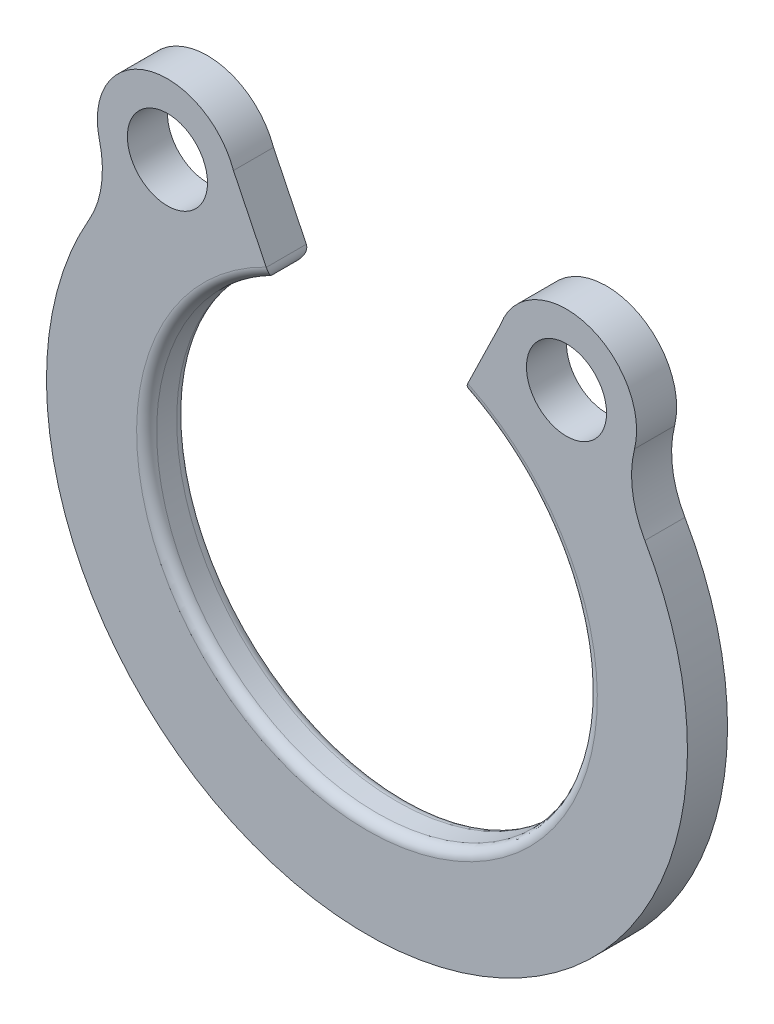
ISO-10303-21;
HEADER;
FILE_DESCRIPTION(('STEP AP214'),'2;1');
FILE_NAME('part.step','',(''),(''),'','','');
FILE_SCHEMA(('AUTOMOTIVE_DESIGN { 1 0 10303 214 1 1 1 1 }'));
ENDSEC;
DATA;
#1=APPLICATION_CONTEXT('core data for automotive mechanical design processes');
#2=APPLICATION_PROTOCOL_DEFINITION('international standard','automotive_design',2000,#1);
#3=PRODUCT_CONTEXT('',#1,'mechanical');
#4=PRODUCT('Part','Part','',(#3));
#5=PRODUCT_RELATED_PRODUCT_CATEGORY('part','',(#4));
#6=PRODUCT_DEFINITION_FORMATION('','',#4);
#7=PRODUCT_DEFINITION_CONTEXT('part definition',#1,'design');
#8=PRODUCT_DEFINITION('design','',#6,#7);
#9=PRODUCT_DEFINITION_SHAPE('','',#8);
#10=(LENGTH_UNIT() NAMED_UNIT(*) SI_UNIT(.MILLI.,.METRE.));
#11=(NAMED_UNIT(*) PLANE_ANGLE_UNIT() SI_UNIT($,.RADIAN.));
#12=(NAMED_UNIT(*) SI_UNIT($,.STERADIAN.) SOLID_ANGLE_UNIT());
#13=UNCERTAINTY_MEASURE_WITH_UNIT(LENGTH_MEASURE(1.E-05),#10,'distance_accuracy_value','');
#14=(GEOMETRIC_REPRESENTATION_CONTEXT(3) GLOBAL_UNCERTAINTY_ASSIGNED_CONTEXT((#13)) GLOBAL_UNIT_ASSIGNED_CONTEXT((#10,
#11,#12)) REPRESENTATION_CONTEXT('',''));
#15=CARTESIAN_POINT('',(0.,0.,0.));
#16=DIRECTION('',(0.,0.,1.));
#17=DIRECTION('',(1.,0.,0.));
#18=AXIS2_PLACEMENT_3D('',#15,#16,#17);
#19=CARTESIAN_POINT('',(0.,0.,-0.5));
#20=DIRECTION('',(0.,0.,1.));
#21=DIRECTION('',(1.,0.,0.));
#22=AXIS2_PLACEMENT_3D('',#19,#20,#21);
#23=CYLINDRICAL_SURFACE('',#22,8.);
#24=CARTESIAN_POINT('',(0.,0.,-0.5));
#25=DIRECTION('',(0.,0.,1.));
#26=DIRECTION('',(1.,0.,0.));
#27=AXIS2_PLACEMENT_3D('',#24,#25,#26);
#28=CIRCLE('',#27,8.);
#29=CARTESIAN_POINT('',(-6.93635011466133,3.98585587883428,-0.5));
#30=VERTEX_POINT('',#29);
#31=CARTESIAN_POINT('',(6.93635011466133,3.98585587883428,-0.5));
#32=VERTEX_POINT('',#31);
#33=EDGE_CURVE('E153',#30,#32,#28,.T.);
#34=ORIENTED_EDGE('',*,*,#33,.T.);
#35=DIRECTION('',(0.,0.,1.));
#36=VECTOR('',#35,1.);
#37=CARTESIAN_POINT('',(6.93635011466133,3.98585587883428,-0.5));
#38=LINE('',#37,#36);
#39=CARTESIAN_POINT('',(6.93635011466133,3.98585587883428,0.5));
#40=VERTEX_POINT('',#39);
#41=EDGE_CURVE('E191',#32,#40,#38,.T.);
#42=ORIENTED_EDGE('',*,*,#41,.T.);
#43=CARTESIAN_POINT('',(0.,0.,0.5));
#44=DIRECTION('',(0.,0.,1.));
#45=DIRECTION('',(1.,0.,0.));
#46=AXIS2_PLACEMENT_3D('',#43,#44,#45);
#47=CIRCLE('',#46,8.);
#48=CARTESIAN_POINT('',(-6.93635011466133,3.98585587883428,0.5));
#49=VERTEX_POINT('',#48);
#50=EDGE_CURVE('E181',#49,#40,#47,.T.);
#51=ORIENTED_EDGE('',*,*,#50,.F.);
#52=DIRECTION('',(0.,0.,1.));
#53=VECTOR('',#52,1.);
#54=CARTESIAN_POINT('',(-6.93635011466133,3.98585587883428,-0.5));
#55=LINE('',#54,#53);
#56=EDGE_CURVE('E152',#49,#30,#55,.F.);
#57=ORIENTED_EDGE('',*,*,#56,.T.);
#58=EDGE_LOOP('',(#34,#42,#51,#57));
#59=FACE_BOUND('',#58,.T.);
#60=ADVANCED_FACE('F35',(#59),#23,.T.);
#61=CARTESIAN_POINT('',(0.,0.,-0.5));
#62=DIRECTION('',(-0.899218410621135,0.4375,0.));
#63=DIRECTION('',(-0.4375,-0.899218410621135,0.));
#64=AXIS2_PLACEMENT_3D('',#61,#62,#63);
#65=PLANE('',#64);
#66=DIRECTION('',(-0.4375,-0.899218410621135,0.));
#67=VECTOR('',#66,1.);
#68=CARTESIAN_POINT('',(0.,0.,-0.5));
#69=LINE('',#68,#67);
#70=CARTESIAN_POINT('',(3.33251953125,6.84951523715318,-0.5));
#71=VERTEX_POINT('',#70);
#72=CARTESIAN_POINT('',(2.515625,5.17050586107153,-0.5));
#73=VERTEX_POINT('',#72);
#74=EDGE_CURVE('E145',#71,#73,#69,.T.);
#75=ORIENTED_EDGE('',*,*,#74,.T.);
#76=CARTESIAN_POINT('',(2.515625,5.17050586107153,-0.25));
#77=DIRECTION('',(-0.899218410621135,0.4375,0.));
#78=DIRECTION('',(-0.4375,-0.899218410621135,0.));
#79=AXIS2_PLACEMENT_3D('',#76,#77,#78);
#80=CIRCLE('',#79,0.25);
#81=CARTESIAN_POINT('',(2.51324615786039,5.16561649273347,-0.49994086338038));
#82=VERTEX_POINT('',#81);
#83=EDGE_CURVE('E210',#73,#82,#80,.T.);
#84=ORIENTED_EDGE('',*,*,#83,.T.);
#85=DIRECTION('',(0.,0.,-1.));
#86=VECTOR('',#85,1.);
#87=CARTESIAN_POINT('',(2.51324615786039,5.16561649273347,0.5));
#88=LINE('',#87,#86);
#89=CARTESIAN_POINT('',(2.51324615786039,5.16561649273347,0.49994086338038));
#90=VERTEX_POINT('',#89);
#91=EDGE_CURVE('E208',#82,#90,#88,.F.);
#92=ORIENTED_EDGE('',*,*,#91,.T.);
#93=CARTESIAN_POINT('',(2.515625,5.17050586107153,0.25));
#94=DIRECTION('',(-0.899218410621135,0.4375,0.));
#95=DIRECTION('',(-0.4375,-0.899218410621135,0.));
#96=AXIS2_PLACEMENT_3D('',#93,#94,#95);
#97=CIRCLE('',#96,0.25);
#98=CARTESIAN_POINT('',(2.515625,5.17050586107153,0.5));
#99=VERTEX_POINT('',#98);
#100=EDGE_CURVE('E206',#90,#99,#97,.T.);
#101=ORIENTED_EDGE('',*,*,#100,.T.);
#102=DIRECTION('',(-0.4375,-0.899218410621135,0.));
#103=VECTOR('',#102,1.);
#104=CARTESIAN_POINT('',(0.,0.,0.5));
#105=LINE('',#104,#103);
#106=CARTESIAN_POINT('',(3.33251953125,6.84951523715318,0.5));
#107=VERTEX_POINT('',#106);
#108=EDGE_CURVE('E158',#107,#99,#105,.T.);
#109=ORIENTED_EDGE('',*,*,#108,.F.);
#110=DIRECTION('',(0.,0.,-1.));
#111=VECTOR('',#110,1.);
#112=CARTESIAN_POINT('',(3.33251953125001,6.84951523715319,5.44974746830583));
#113=LINE('',#112,#111);
#114=EDGE_CURVE('E135',#107,#71,#113,.T.);
#115=ORIENTED_EDGE('',*,*,#114,.T.);
#116=EDGE_LOOP('',(#75,#84,#92,#101,#109,#115));
#117=FACE_BOUND('',#116,.T.);
#118=ADVANCED_FACE('F156',(#117),#65,.T.);
#119=CARTESIAN_POINT('',(0.,0.,-0.5));
#120=DIRECTION('',(0.899218410621135,0.4375,0.));
#121=DIRECTION('',(-0.4375,0.899218410621135,0.));
#122=AXIS2_PLACEMENT_3D('',#119,#120,#121);
#123=PLANE('',#122);
#124=DIRECTION('',(0.,0.,-1.));
#125=VECTOR('',#124,1.);
#126=CARTESIAN_POINT('',(-2.51324615786039,5.16561649273347,-0.5));
#127=LINE('',#126,#125);
#128=CARTESIAN_POINT('',(-2.51324615786039,5.16561649273347,0.49994086338038));
#129=VERTEX_POINT('',#128);
#130=CARTESIAN_POINT('',(-2.51324615786039,5.16561649273347,-0.49994086338038));
#131=VERTEX_POINT('',#130);
#132=EDGE_CURVE('E57',#129,#131,#127,.T.);
#133=ORIENTED_EDGE('',*,*,#132,.T.);
#134=CARTESIAN_POINT('',(-2.515625,5.17050586107153,-0.25));
#135=DIRECTION('',(0.899218410621135,0.4375,0.));
#136=DIRECTION('',(-0.4375,0.899218410621135,0.));
#137=AXIS2_PLACEMENT_3D('',#134,#135,#136);
#138=CIRCLE('',#137,0.25);
#139=CARTESIAN_POINT('',(-2.515625,5.17050586107153,-0.5));
#140=VERTEX_POINT('',#139);
#141=EDGE_CURVE('E49',#131,#140,#138,.T.);
#142=ORIENTED_EDGE('',*,*,#141,.T.);
#143=DIRECTION('',(-0.4375,0.899218410621135,0.));
#144=VECTOR('',#143,1.);
#145=CARTESIAN_POINT('',(0.,0.,-0.5));
#146=LINE('',#145,#144);
#147=CARTESIAN_POINT('',(-3.33251953125,6.84951523715318,-0.5));
#148=VERTEX_POINT('',#147);
#149=EDGE_CURVE('E185',#140,#148,#146,.T.);
#150=ORIENTED_EDGE('',*,*,#149,.T.);
#151=DIRECTION('',(0.,0.,-1.));
#152=VECTOR('',#151,1.);
#153=CARTESIAN_POINT('',(-3.33251953125,6.84951523715318,5.44974746830583));
#154=LINE('',#153,#152);
#155=CARTESIAN_POINT('',(-3.33251953125,6.84951523715318,0.5));
#156=VERTEX_POINT('',#155);
#157=EDGE_CURVE('E174',#148,#156,#154,.F.);
#158=ORIENTED_EDGE('',*,*,#157,.T.);
#159=DIRECTION('',(-0.4375,0.899218410621135,0.));
#160=VECTOR('',#159,1.);
#161=CARTESIAN_POINT('',(0.,0.,0.5));
#162=LINE('',#161,#160);
#163=CARTESIAN_POINT('',(-2.515625,5.17050586107153,0.5));
#164=VERTEX_POINT('',#163);
#165=EDGE_CURVE('E179',#164,#156,#162,.T.);
#166=ORIENTED_EDGE('',*,*,#165,.F.);
#167=CARTESIAN_POINT('',(-2.515625,5.17050586107153,0.25));
#168=DIRECTION('',(0.899218410621135,0.4375,0.));
#169=DIRECTION('',(-0.4375,0.899218410621135,0.));
#170=AXIS2_PLACEMENT_3D('',#167,#168,#169);
#171=CIRCLE('',#170,0.25);
#172=EDGE_CURVE('E62',#164,#129,#171,.T.);
#173=ORIENTED_EDGE('',*,*,#172,.T.);
#174=EDGE_LOOP('',(#133,#142,#150,#158,#166,#173));
#175=FACE_BOUND('',#174,.T.);
#176=ADVANCED_FACE('F265',(#175),#123,.T.);
#177=CARTESIAN_POINT('',(0.,0.,-0.5));
#178=DIRECTION('',(0.,0.,1.));
#179=DIRECTION('',(1.,0.,0.));
#180=AXIS2_PLACEMENT_3D('',#177,#178,#179);
#181=CYLINDRICAL_SURFACE('',#180,5.5);
#182=DIRECTION('',(0.,0.,1.));
#183=VECTOR('',#182,1.);
#184=CARTESIAN_POINT('',(2.61900507527586,4.83640490609288,-0.5));
#185=LINE('',#184,#183);
#186=CARTESIAN_POINT('',(2.61900507527586,4.83640490609288,0.25));
#187=VERTEX_POINT('',#186);
#188=CARTESIAN_POINT('',(2.61900507527586,4.83640490609288,-0.25));
#189=VERTEX_POINT('',#188);
#190=EDGE_CURVE('E216',#187,#189,#185,.F.);
#191=ORIENTED_EDGE('',*,*,#190,.T.);
#192=CARTESIAN_POINT('',(0.,0.,-0.25));
#193=DIRECTION('',(0.,0.,1.));
#194=DIRECTION('',(1.,0.,0.));
#195=AXIS2_PLACEMENT_3D('',#192,#193,#194);
#196=CIRCLE('',#195,5.5);
#197=CARTESIAN_POINT('',(-2.61900507527586,4.83640490609288,-0.25));
#198=VERTEX_POINT('',#197);
#199=EDGE_CURVE('E218',#189,#198,#196,.F.);
#200=ORIENTED_EDGE('',*,*,#199,.T.);
#201=DIRECTION('',(0.,0.,1.));
#202=VECTOR('',#201,1.);
#203=CARTESIAN_POINT('',(-2.61900507527586,4.83640490609288,-0.5));
#204=LINE('',#203,#202);
#205=CARTESIAN_POINT('',(-2.61900507527586,4.83640490609288,0.25));
#206=VERTEX_POINT('',#205);
#207=EDGE_CURVE('E212',#198,#206,#204,.T.);
#208=ORIENTED_EDGE('',*,*,#207,.T.);
#209=CARTESIAN_POINT('',(0.,0.,0.25));
#210=DIRECTION('',(0.,0.,1.));
#211=DIRECTION('',(1.,0.,0.));
#212=AXIS2_PLACEMENT_3D('',#209,#210,#211);
#213=CIRCLE('',#212,5.5);
#214=EDGE_CURVE('E214',#206,#187,#213,.T.);
#215=ORIENTED_EDGE('',*,*,#214,.T.);
#216=EDGE_LOOP('',(#191,#200,#208,#215));
#217=FACE_BOUND('',#216,.T.);
#218=ADVANCED_FACE('F271',(#217),#181,.F.);
#219=CARTESIAN_POINT('',(0.,0.,-0.5));
#220=DIRECTION('',(0.,0.,1.));
#221=DIRECTION('',(1.,0.,0.));
#222=AXIS2_PLACEMENT_3D('',#219,#220,#221);
#223=PLANE('',#222);
#224=ORIENTED_EDGE('',*,*,#149,.F.);
#225=CARTESIAN_POINT('',(0.,0.,-0.5));
#226=DIRECTION('',(0.,0.,1.));
#227=DIRECTION('',(1.,0.,0.));
#228=AXIS2_PLACEMENT_3D('',#225,#226,#227);
#229=CIRCLE('',#228,5.75);
#230=EDGE_CURVE('E150',#140,#73,#229,.T.);
#231=ORIENTED_EDGE('',*,*,#230,.T.);
#232=ORIENTED_EDGE('',*,*,#74,.F.);
#233=CARTESIAN_POINT('',(4.9804510690432,6.26059958381516,-0.5));
#234=DIRECTION('',(0.,0.,1.));
#235=DIRECTION('',(1.,0.,0.));
#236=AXIS2_PLACEMENT_3D('',#233,#234,#235);
#237=CIRCLE('',#236,1.75);
#238=CARTESIAN_POINT('',(6.67836631581664,5.83682627793774,-0.5));
#239=VERTEX_POINT('',#238);
#240=EDGE_CURVE('E130',#71,#239,#237,.F.);
#241=ORIENTED_EDGE('',*,*,#240,.T.);
#242=CARTESIAN_POINT('',(9.10395952549299,5.23143584096999,-0.5));
#243=DIRECTION('',(0.,0.,1.));
#244=DIRECTION('',(1.,0.,0.));
#245=AXIS2_PLACEMENT_3D('',#242,#243,#244);
#246=CIRCLE('',#245,2.5);
#247=EDGE_CURVE('E199',#239,#32,#246,.T.);
#248=ORIENTED_EDGE('',*,*,#247,.T.);
#249=ORIENTED_EDGE('',*,*,#33,.F.);
#250=CARTESIAN_POINT('',(-9.10395952549299,5.23143584097,-0.5));
#251=DIRECTION('',(0.,0.,1.));
#252=DIRECTION('',(1.,0.,0.));
#253=AXIS2_PLACEMENT_3D('',#250,#251,#252);
#254=CIRCLE('',#253,2.5);
#255=CARTESIAN_POINT('',(-6.67836631581664,5.83682627793774,-0.5));
#256=VERTEX_POINT('',#255);
#257=EDGE_CURVE('E201',#30,#256,#254,.T.);
#258=ORIENTED_EDGE('',*,*,#257,.T.);
#259=CARTESIAN_POINT('',(-4.9804510690432,6.26059958381516,-0.5));
#260=DIRECTION('',(0.,0.,1.));
#261=DIRECTION('',(1.,0.,0.));
#262=AXIS2_PLACEMENT_3D('',#259,#260,#261);
#263=CIRCLE('',#262,1.75);
#264=EDGE_CURVE('E163',#256,#148,#263,.F.);
#265=ORIENTED_EDGE('',*,*,#264,.T.);
#266=EDGE_LOOP('',(#224,#231,#232,#241,#248,#249,#258,#265));
#267=FACE_BOUND('',#266,.T.);
#268=CARTESIAN_POINT('',(4.9804510690432,6.26059958381516,-0.5));
#269=DIRECTION('',(0.,0.,1.));
#270=DIRECTION('',(1.,0.,0.));
#271=AXIS2_PLACEMENT_3D('',#268,#269,#270);
#272=CIRCLE('',#271,1.);
#273=CARTESIAN_POINT('',(5.9804510690432,6.26059958381516,-0.5));
#274=VERTEX_POINT('',#273);
#275=EDGE_CURVE('E141',#274,#274,#272,.F.);
#276=ORIENTED_EDGE('',*,*,#275,.F.);
#277=EDGE_LOOP('',(#276));
#278=FACE_BOUND('',#277,.T.);
#279=CARTESIAN_POINT('',(-4.9804510690432,6.26059958381516,-0.5));
#280=DIRECTION('',(0.,0.,1.));
#281=DIRECTION('',(1.,0.,0.));
#282=AXIS2_PLACEMENT_3D('',#279,#280,#281);
#283=CIRCLE('',#282,1.);
#284=CARTESIAN_POINT('',(-3.9804510690432,6.26059958381516,-0.5));
#285=VERTEX_POINT('',#284);
#286=EDGE_CURVE('E159',#285,#285,#283,.F.);
#287=ORIENTED_EDGE('',*,*,#286,.F.);
#288=EDGE_LOOP('',(#287));
#289=FACE_BOUND('',#288,.T.);
#290=ADVANCED_FACE('F147',(#267,#278,#289),#223,.F.);
#291=CARTESIAN_POINT('',(0.,0.,0.5));
#292=DIRECTION('',(0.,0.,1.));
#293=DIRECTION('',(1.,0.,0.));
#294=AXIS2_PLACEMENT_3D('',#291,#292,#293);
#295=PLANE('',#294);
#296=CARTESIAN_POINT('',(-4.9804510690432,6.26059958381516,0.5));
#297=DIRECTION('',(0.,0.,1.));
#298=DIRECTION('',(1.,0.,0.));
#299=AXIS2_PLACEMENT_3D('',#296,#297,#298);
#300=CIRCLE('',#299,1.);
#301=CARTESIAN_POINT('',(-3.9804510690432,6.26059958381516,0.5));
#302=VERTEX_POINT('',#301);
#303=EDGE_CURVE('E169',#302,#302,#300,.T.);
#304=ORIENTED_EDGE('',*,*,#303,.F.);
#305=EDGE_LOOP('',(#304));
#306=FACE_BOUND('',#305,.T.);
#307=CARTESIAN_POINT('',(4.9804510690432,6.26059958381516,0.5));
#308=DIRECTION('',(0.,0.,1.));
#309=DIRECTION('',(1.,0.,0.));
#310=AXIS2_PLACEMENT_3D('',#307,#308,#309);
#311=CIRCLE('',#310,1.);
#312=CARTESIAN_POINT('',(5.9804510690432,6.26059958381516,0.5));
#313=VERTEX_POINT('',#312);
#314=EDGE_CURVE('E140',#313,#313,#311,.T.);
#315=ORIENTED_EDGE('',*,*,#314,.F.);
#316=EDGE_LOOP('',(#315));
#317=FACE_BOUND('',#316,.T.);
#318=ORIENTED_EDGE('',*,*,#108,.T.);
#319=CARTESIAN_POINT('',(0.,0.,0.5));
#320=DIRECTION('',(0.,0.,1.));
#321=DIRECTION('',(1.,0.,0.));
#322=AXIS2_PLACEMENT_3D('',#319,#320,#321);
#323=CIRCLE('',#322,5.75);
#324=EDGE_CURVE('E11',#99,#164,#323,.F.);
#325=ORIENTED_EDGE('',*,*,#324,.T.);
#326=ORIENTED_EDGE('',*,*,#165,.T.);
#327=CARTESIAN_POINT('',(-4.9804510690432,6.26059958381516,0.5));
#328=DIRECTION('',(0.,0.,1.));
#329=DIRECTION('',(1.,0.,0.));
#330=AXIS2_PLACEMENT_3D('',#327,#328,#329);
#331=CIRCLE('',#330,1.75);
#332=CARTESIAN_POINT('',(-6.67836631581664,5.83682627793774,0.5));
#333=VERTEX_POINT('',#332);
#334=EDGE_CURVE('E171',#156,#333,#331,.T.);
#335=ORIENTED_EDGE('',*,*,#334,.T.);
#336=CARTESIAN_POINT('',(-9.10395952549299,5.23143584097,0.5));
#337=DIRECTION('',(0.,0.,1.));
#338=DIRECTION('',(1.,0.,0.));
#339=AXIS2_PLACEMENT_3D('',#336,#337,#338);
#340=CIRCLE('',#339,2.5);
#341=EDGE_CURVE('E203',#333,#49,#340,.F.);
#342=ORIENTED_EDGE('',*,*,#341,.T.);
#343=ORIENTED_EDGE('',*,*,#50,.T.);
#344=CARTESIAN_POINT('',(9.10395952549299,5.23143584096999,0.5));
#345=DIRECTION('',(0.,0.,1.));
#346=DIRECTION('',(1.,0.,0.));
#347=AXIS2_PLACEMENT_3D('',#344,#345,#346);
#348=CIRCLE('',#347,2.5);
#349=CARTESIAN_POINT('',(6.67836631581664,5.83682627793774,0.5));
#350=VERTEX_POINT('',#349);
#351=EDGE_CURVE('E197',#40,#350,#348,.F.);
#352=ORIENTED_EDGE('',*,*,#351,.T.);
#353=CARTESIAN_POINT('',(4.9804510690432,6.26059958381516,0.5));
#354=DIRECTION('',(0.,0.,1.));
#355=DIRECTION('',(1.,0.,0.));
#356=AXIS2_PLACEMENT_3D('',#353,#354,#355);
#357=CIRCLE('',#356,1.75);
#358=EDGE_CURVE('E160',#350,#107,#357,.T.);
#359=ORIENTED_EDGE('',*,*,#358,.T.);
#360=EDGE_LOOP('',(#318,#325,#326,#335,#342,#343,#352,#359));
#361=FACE_BOUND('',#360,.T.);
#362=ADVANCED_FACE('F288',(#306,#317,#361),#295,.T.);
#363=CARTESIAN_POINT('',(-4.9804510690432,6.26059958381516,5.44974746830583));
#364=DIRECTION('',(0.,0.,-1.));
#365=DIRECTION('',(-1.,0.,0.));
#366=AXIS2_PLACEMENT_3D('',#363,#364,#365);
#367=CYLINDRICAL_SURFACE('',#366,1.75);
#368=ORIENTED_EDGE('',*,*,#264,.F.);
#369=DIRECTION('',(0.,0.,-1.));
#370=VECTOR('',#369,1.);
#371=CARTESIAN_POINT('',(-6.67836631581664,5.83682627793774,5.44974746830583));
#372=LINE('',#371,#370);
#373=EDGE_CURVE('E195',#256,#333,#372,.F.);
#374=ORIENTED_EDGE('',*,*,#373,.T.);
#375=ORIENTED_EDGE('',*,*,#334,.F.);
#376=ORIENTED_EDGE('',*,*,#157,.F.);
#377=EDGE_LOOP('',(#368,#374,#375,#376));
#378=FACE_BOUND('',#377,.T.);
#379=ADVANCED_FACE('F304',(#378),#367,.T.);
#380=CARTESIAN_POINT('',(-4.9804510690432,6.26059958381516,5.44974746830583));
#381=DIRECTION('',(0.,0.,-1.));
#382=DIRECTION('',(-1.,0.,0.));
#383=AXIS2_PLACEMENT_3D('',#380,#381,#382);
#384=CYLINDRICAL_SURFACE('',#383,1.);
#385=ORIENTED_EDGE('',*,*,#286,.T.);
#386=EDGE_LOOP('',(#385));
#387=FACE_BOUND('',#386,.T.);
#388=ORIENTED_EDGE('',*,*,#303,.T.);
#389=EDGE_LOOP('',(#388));
#390=FACE_BOUND('',#389,.T.);
#391=ADVANCED_FACE('F306',(#387,#390),#384,.F.);
#392=CARTESIAN_POINT('',(4.9804510690432,6.26059958381516,5.44974746830583));
#393=DIRECTION('',(0.,0.,-1.));
#394=DIRECTION('',(-1.,0.,0.));
#395=AXIS2_PLACEMENT_3D('',#392,#393,#394);
#396=CYLINDRICAL_SURFACE('',#395,1.75);
#397=ORIENTED_EDGE('',*,*,#358,.F.);
#398=DIRECTION('',(0.,0.,-1.));
#399=VECTOR('',#398,1.);
#400=CARTESIAN_POINT('',(6.67836631581664,5.83682627793774,5.44974746830583));
#401=LINE('',#400,#399);
#402=EDGE_CURVE('E137',#350,#239,#401,.T.);
#403=ORIENTED_EDGE('',*,*,#402,.T.);
#404=ORIENTED_EDGE('',*,*,#240,.F.);
#405=ORIENTED_EDGE('',*,*,#114,.F.);
#406=EDGE_LOOP('',(#397,#403,#404,#405));
#407=FACE_BOUND('',#406,.T.);
#408=ADVANCED_FACE('F133',(#407),#396,.T.);
#409=CARTESIAN_POINT('',(4.9804510690432,6.26059958381516,5.44974746830583));
#410=DIRECTION('',(0.,0.,-1.));
#411=DIRECTION('',(-1.,0.,0.));
#412=AXIS2_PLACEMENT_3D('',#409,#410,#411);
#413=CYLINDRICAL_SURFACE('',#412,1.);
#414=ORIENTED_EDGE('',*,*,#275,.T.);
#415=EDGE_LOOP('',(#414));
#416=FACE_BOUND('',#415,.T.);
#417=ORIENTED_EDGE('',*,*,#314,.T.);
#418=EDGE_LOOP('',(#417));
#419=FACE_BOUND('',#418,.T.);
#420=ADVANCED_FACE('F277',(#416,#419),#413,.F.);
#421=CARTESIAN_POINT('',(9.10395952549299,5.23143584096999,5.44974746830583));
#422=DIRECTION('',(0.,0.,-1.));
#423=DIRECTION('',(-1.,0.,0.));
#424=AXIS2_PLACEMENT_3D('',#421,#422,#423);
#425=CYLINDRICAL_SURFACE('',#424,2.5);
#426=ORIENTED_EDGE('',*,*,#247,.F.);
#427=ORIENTED_EDGE('',*,*,#402,.F.);
#428=ORIENTED_EDGE('',*,*,#351,.F.);
#429=ORIENTED_EDGE('',*,*,#41,.F.);
#430=EDGE_LOOP('',(#426,#427,#428,#429));
#431=FACE_BOUND('',#430,.T.);
#432=ADVANCED_FACE('F275',(#431),#425,.F.);
#433=CARTESIAN_POINT('',(-9.10395952549299,5.23143584097,5.44974746830583));
#434=DIRECTION('',(0.,0.,1.));
#435=DIRECTION('',(1.,0.,0.));
#436=AXIS2_PLACEMENT_3D('',#433,#434,#435);
#437=CYLINDRICAL_SURFACE('',#436,2.5);
#438=ORIENTED_EDGE('',*,*,#341,.F.);
#439=ORIENTED_EDGE('',*,*,#373,.F.);
#440=ORIENTED_EDGE('',*,*,#257,.F.);
#441=ORIENTED_EDGE('',*,*,#56,.F.);
#442=EDGE_LOOP('',(#438,#439,#440,#441));
#443=FACE_BOUND('',#442,.T.);
#444=ADVANCED_FACE('F256',(#443),#437,.F.);
#445=CARTESIAN_POINT('',(0.,0.,0.25));
#446=DIRECTION('',(0.,0.,1.));
#447=DIRECTION('',(1.,0.,0.));
#448=AXIS2_PLACEMENT_3D('',#445,#446,#447);
#449=TOROIDAL_SURFACE('',#448,5.75,0.25);
#450=CARTESIAN_POINT('',(2.51324615786039,5.16561649273347,0.49994086338038));
#451=CARTESIAN_POINT('',(2.50828021385128,5.15545252221124,0.499714083352905));
#452=CARTESIAN_POINT('',(2.50405837557174,5.14498055006981,0.49868289522799));
#453=CARTESIAN_POINT('',(2.49712612029501,5.12387978877661,0.495190540188425));
#454=CARTESIAN_POINT('',(2.49440246339241,5.11325325417818,0.492742305501947));
#455=CARTESIAN_POINT('',(2.49040694884898,5.09213860660682,0.486593917703645));
#456=CARTESIAN_POINT('',(2.48913076006901,5.08165017399461,0.482897542605564));
#457=CARTESIAN_POINT('',(2.48788183046502,5.06100300052579,0.474467558744442));
#458=CARTESIAN_POINT('',(2.48791215500255,5.05084509098129,0.469731536625399));
#459=CARTESIAN_POINT('',(2.48938938000728,5.0267521287806,0.457208121685012));
#460=CARTESIAN_POINT('',(2.49144240437091,5.01308042152554,0.448986259260633));
#461=CARTESIAN_POINT('',(2.49746117753397,4.98698294490106,0.431355499346529));
#462=CARTESIAN_POINT('',(2.50143092802741,4.97455984820474,0.421944148957237));
#463=CARTESIAN_POINT('',(2.51283862221255,4.94625203345462,0.398320241462926));
#464=CARTESIAN_POINT('',(2.52103017132891,4.93100636479397,0.383708307426565));
#465=CARTESIAN_POINT('',(2.53973089274298,4.90310222286458,0.353560152462565));
#466=CARTESIAN_POINT('',(2.55024174169464,4.89044563409872,0.338023268839881));
#467=CARTESIAN_POINT('',(2.57001183603936,4.87076613862821,0.310744929296885));
#468=CARTESIAN_POINT('',(2.5788406002066,4.86314539534665,0.299113604746922));
#469=CARTESIAN_POINT('',(2.59734492600371,4.84927459931996,0.275740337263321));
#470=CARTESIAN_POINT('',(2.60701895421714,4.84302213373091,0.263998627761837));
#471=CARTESIAN_POINT('',(2.61771044330156,4.83710968463429,0.251507161753844));
#472=CARTESIAN_POINT('',(2.61835699929709,4.8367558567492,0.250753563752166));
#473=CARTESIAN_POINT('',(2.61900507527586,4.83640490609288,0.25));
#474=B_SPLINE_CURVE_WITH_KNOTS('',3,(#450,#451,#452,#453,#454,#455,#456,#457,#458,#459,#460,
#461,#462,#463,#464,#465,#466,#467,#468,#469,#470,#471,#472,#473),.UNSPECIFIED.,.F.,.F.,(4,2,2,
2,2,2,2,2,2,2,2,4),(0.,0.0338400456219434,0.067376023933256,0.100811388369374,0.134325203632232,
0.182312705753331,0.23040083108484,0.297988720018013,0.365625630186421,0.414967388451733,
0.464221422671975,0.467383715449194),.UNSPECIFIED.);
#475=EDGE_CURVE('E298',#187,#90,#474,.F.);
#476=ORIENTED_EDGE('',*,*,#475,.F.);
#477=ORIENTED_EDGE('',*,*,#214,.F.);
#478=CARTESIAN_POINT('',(-2.51324615786039,5.16561649273347,0.49994086338038));
#479=CARTESIAN_POINT('',(-2.50828021385128,5.15545252221124,0.499714083352905));
#480=CARTESIAN_POINT('',(-2.50405837557174,5.14498055006981,0.49868289522799));
#481=CARTESIAN_POINT('',(-2.49712612029501,5.12387978877661,0.495190540188425));
#482=CARTESIAN_POINT('',(-2.49440246339241,5.11325325417818,0.492742305501947));
#483=CARTESIAN_POINT('',(-2.49040694884898,5.09213860660682,0.486593917703645));
#484=CARTESIAN_POINT('',(-2.48913076006901,5.08165017399461,0.482897542605564));
#485=CARTESIAN_POINT('',(-2.48788183046502,5.06100300052579,0.474467558744442));
#486=CARTESIAN_POINT('',(-2.48791215500255,5.05084509098129,0.469731536625399));
#487=CARTESIAN_POINT('',(-2.48938938000728,5.0267521287806,0.457208121685012));
#488=CARTESIAN_POINT('',(-2.49144240437091,5.01308042152554,0.448986259260633));
#489=CARTESIAN_POINT('',(-2.49746117753397,4.98698294490106,0.431355499346529));
#490=CARTESIAN_POINT('',(-2.50143092802741,4.97455984820474,0.421944148957237));
#491=CARTESIAN_POINT('',(-2.51283862221255,4.94625203345462,0.398320241462926));
#492=CARTESIAN_POINT('',(-2.52103017132891,4.93100636479397,0.383708307426565));
#493=CARTESIAN_POINT('',(-2.53973089274298,4.90310222286458,0.353560152462565));
#494=CARTESIAN_POINT('',(-2.55024174169464,4.89044563409872,0.338023268839881));
#495=CARTESIAN_POINT('',(-2.57001183603936,4.87076613862821,0.310744929296885));
#496=CARTESIAN_POINT('',(-2.5788406002066,4.86314539534665,0.299113604746922));
#497=CARTESIAN_POINT('',(-2.59734492600371,4.84927459931996,0.275740337263321));
#498=CARTESIAN_POINT('',(-2.60701895421714,4.84302213373091,0.263998627761837));
#499=CARTESIAN_POINT('',(-2.61771044330156,4.83710968463429,0.251507161753844));
#500=CARTESIAN_POINT('',(-2.61835699929709,4.8367558567492,0.250753563752166));
#501=CARTESIAN_POINT('',(-2.61900507527586,4.83640490609288,0.25));
#502=B_SPLINE_CURVE_WITH_KNOTS('',3,(#478,#479,#480,#481,#482,#483,#484,#485,#486,#487,#488,
#489,#490,#491,#492,#493,#494,#495,#496,#497,#498,#499,#500,#501),.UNSPECIFIED.,.F.,.F.,(4,2,2,
2,2,2,2,2,2,2,2,4),(0.,0.0338400456219434,0.067376023933256,0.100811388369374,0.134325203632232,
0.182312705753331,0.23040083108484,0.297988720018013,0.365625630186421,0.414967388451733,
0.464221422671975,0.467383715449194),.UNSPECIFIED.);
#503=EDGE_CURVE('E40',#129,#206,#502,.T.);
#504=ORIENTED_EDGE('',*,*,#503,.F.);
#505=ORIENTED_EDGE('',*,*,#172,.F.);
#506=ORIENTED_EDGE('',*,*,#324,.F.);
#507=ORIENTED_EDGE('',*,*,#100,.F.);
#508=EDGE_LOOP('',(#476,#477,#504,#505,#506,#507));
#509=FACE_BOUND('',#508,.T.);
#510=ADVANCED_FACE('F37',(#509),#449,.T.);
#511=CARTESIAN_POINT('',(-2.73805076051567,5.05624149273347,-0.5));
#512=DIRECTION('',(0.,0.,1.));
#513=DIRECTION('',(1.,0.,0.));
#514=AXIS2_PLACEMENT_3D('',#511,#512,#513);
#515=CYLINDRICAL_SURFACE('',#514,0.25);
#516=ORIENTED_EDGE('',*,*,#503,.T.);
#517=ORIENTED_EDGE('',*,*,#207,.F.);
#518=CARTESIAN_POINT('',(-2.51324615786039,5.16561649273347,-0.49994086338038));
#519=CARTESIAN_POINT('',(-2.50828021385128,5.15545252221124,-0.499714083352905));
#520=CARTESIAN_POINT('',(-2.50405837557174,5.14498055006981,-0.49868289522799));
#521=CARTESIAN_POINT('',(-2.49712612029501,5.12387978877661,-0.495190540188425));
#522=CARTESIAN_POINT('',(-2.49440246339241,5.11325325417818,-0.492742305501947));
#523=CARTESIAN_POINT('',(-2.49040694884898,5.09213860660682,-0.486593917703645));
#524=CARTESIAN_POINT('',(-2.48913076006901,5.08165017399461,-0.482897542605564));
#525=CARTESIAN_POINT('',(-2.48788183046502,5.06100300052579,-0.474467558744442));
#526=CARTESIAN_POINT('',(-2.48791215500255,5.05084509098129,-0.469731536625399));
#527=CARTESIAN_POINT('',(-2.48938938000728,5.0267521287806,-0.457208121685012));
#528=CARTESIAN_POINT('',(-2.49144240437091,5.01308042152554,-0.448986259260633));
#529=CARTESIAN_POINT('',(-2.49746117753397,4.98698294490106,-0.431355499346529));
#530=CARTESIAN_POINT('',(-2.50143092802741,4.97455984820474,-0.421944148957237));
#531=CARTESIAN_POINT('',(-2.51283862221255,4.94625203345462,-0.398320241462926));
#532=CARTESIAN_POINT('',(-2.52103017132891,4.93100636479397,-0.383708307426565));
#533=CARTESIAN_POINT('',(-2.53973089274298,4.90310222286458,-0.353560152462565));
#534=CARTESIAN_POINT('',(-2.55024174169464,4.89044563409872,-0.338023268839881));
#535=CARTESIAN_POINT('',(-2.57001183603936,4.87076613862821,-0.310744929296885));
#536=CARTESIAN_POINT('',(-2.5788406002066,4.86314539534665,-0.299113604746922));
#537=CARTESIAN_POINT('',(-2.59734492600371,4.84927459931996,-0.275740337263321));
#538=CARTESIAN_POINT('',(-2.60701895421714,4.84302213373091,-0.263998627761837));
#539=CARTESIAN_POINT('',(-2.61771044330156,4.83710968463429,-0.251507161753844));
#540=CARTESIAN_POINT('',(-2.61835699929709,4.8367558567492,-0.250753563752166));
#541=CARTESIAN_POINT('',(-2.61900507527586,4.83640490609288,-0.25));
#542=B_SPLINE_CURVE_WITH_KNOTS('',3,(#518,#519,#520,#521,#522,#523,#524,#525,#526,#527,#528,
#529,#530,#531,#532,#533,#534,#535,#536,#537,#538,#539,#540,#541),.UNSPECIFIED.,.F.,.F.,(4,2,2,
2,2,2,2,2,2,2,2,4),(0.,0.0338400456219434,0.067376023933256,0.100811388369374,0.134325203632232,
0.182312705753331,0.23040083108484,0.297988720018013,0.365625630186421,0.414967388451733,
0.464221422671975,0.467383715449194),.UNSPECIFIED.);
#543=EDGE_CURVE('E233',#131,#198,#542,.T.);
#544=ORIENTED_EDGE('',*,*,#543,.F.);
#545=ORIENTED_EDGE('',*,*,#132,.F.);
#546=EDGE_LOOP('',(#516,#517,#544,#545));
#547=FACE_BOUND('',#546,.T.);
#548=ADVANCED_FACE('F245',(#547),#515,.T.);
#549=CARTESIAN_POINT('',(2.73805076051567,5.05624149273347,-0.5));
#550=DIRECTION('',(0.,0.,1.));
#551=DIRECTION('',(1.,0.,0.));
#552=AXIS2_PLACEMENT_3D('',#549,#550,#551);
#553=CYLINDRICAL_SURFACE('',#552,0.25);
#554=ORIENTED_EDGE('',*,*,#475,.T.);
#555=ORIENTED_EDGE('',*,*,#91,.F.);
#556=CARTESIAN_POINT('',(2.51324615786039,5.16561649273347,-0.49994086338038));
#557=CARTESIAN_POINT('',(2.50828021385128,5.15545252221124,-0.499714083352905));
#558=CARTESIAN_POINT('',(2.50405837557174,5.14498055006981,-0.49868289522799));
#559=CARTESIAN_POINT('',(2.49712612029501,5.12387978877661,-0.495190540188425));
#560=CARTESIAN_POINT('',(2.49440246339241,5.11325325417818,-0.492742305501947));
#561=CARTESIAN_POINT('',(2.49040694884898,5.09213860660682,-0.486593917703645));
#562=CARTESIAN_POINT('',(2.48913076006901,5.08165017399461,-0.482897542605564));
#563=CARTESIAN_POINT('',(2.48788183046502,5.06100300052579,-0.474467558744442));
#564=CARTESIAN_POINT('',(2.48791215500255,5.05084509098129,-0.469731536625399));
#565=CARTESIAN_POINT('',(2.48938938000728,5.0267521287806,-0.457208121685012));
#566=CARTESIAN_POINT('',(2.49144240437091,5.01308042152554,-0.448986259260633));
#567=CARTESIAN_POINT('',(2.49746117753397,4.98698294490106,-0.431355499346529));
#568=CARTESIAN_POINT('',(2.50143092802741,4.97455984820474,-0.421944148957237));
#569=CARTESIAN_POINT('',(2.51283862221255,4.94625203345462,-0.398320241462926));
#570=CARTESIAN_POINT('',(2.52103017132891,4.93100636479397,-0.383708307426565));
#571=CARTESIAN_POINT('',(2.53973089274298,4.90310222286458,-0.353560152462565));
#572=CARTESIAN_POINT('',(2.55024174169464,4.89044563409872,-0.338023268839881));
#573=CARTESIAN_POINT('',(2.57001183603936,4.87076613862821,-0.310744929296885));
#574=CARTESIAN_POINT('',(2.5788406002066,4.86314539534665,-0.299113604746922));
#575=CARTESIAN_POINT('',(2.59734492600371,4.84927459931996,-0.275740337263321));
#576=CARTESIAN_POINT('',(2.60701895421714,4.84302213373091,-0.263998627761837));
#577=CARTESIAN_POINT('',(2.61771044330156,4.83710968463429,-0.251507161753844));
#578=CARTESIAN_POINT('',(2.61835699929709,4.8367558567492,-0.250753563752166));
#579=CARTESIAN_POINT('',(2.61900507527586,4.83640490609288,-0.25));
#580=B_SPLINE_CURVE_WITH_KNOTS('',3,(#556,#557,#558,#559,#560,#561,#562,#563,#564,#565,#566,
#567,#568,#569,#570,#571,#572,#573,#574,#575,#576,#577,#578,#579),.UNSPECIFIED.,.F.,.F.,(4,2,2,
2,2,2,2,2,2,2,2,4),(0.,0.0338400456219434,0.067376023933256,0.100811388369374,0.134325203632232,
0.182312705753331,0.23040083108484,0.297988720018013,0.365625630186421,0.414967388451733,
0.464221422671975,0.467383715449194),.UNSPECIFIED.);
#581=EDGE_CURVE('E224',#189,#82,#580,.F.);
#582=ORIENTED_EDGE('',*,*,#581,.F.);
#583=ORIENTED_EDGE('',*,*,#190,.F.);
#584=EDGE_LOOP('',(#554,#555,#582,#583));
#585=FACE_BOUND('',#584,.T.);
#586=ADVANCED_FACE('F238',(#585),#553,.T.);
#587=CARTESIAN_POINT('',(0.,0.,-0.25));
#588=DIRECTION('',(0.,0.,1.));
#589=DIRECTION('',(1.,0.,0.));
#590=AXIS2_PLACEMENT_3D('',#587,#588,#589);
#591=TOROIDAL_SURFACE('',#590,5.75,0.25);
#592=ORIENTED_EDGE('',*,*,#543,.T.);
#593=ORIENTED_EDGE('',*,*,#199,.F.);
#594=ORIENTED_EDGE('',*,*,#581,.T.);
#595=ORIENTED_EDGE('',*,*,#83,.F.);
#596=ORIENTED_EDGE('',*,*,#230,.F.);
#597=ORIENTED_EDGE('',*,*,#141,.F.);
#598=EDGE_LOOP('',(#592,#593,#594,#595,#596,#597));
#599=FACE_BOUND('',#598,.T.);
#600=ADVANCED_FACE('F241',(#599),#591,.T.);
#601=CLOSED_SHELL('',(#60,#118,#176,#218,#290,#362,#379,#391,#408,#420,#432,#444,#510,#548,#586,#600));
#602=MANIFOLD_SOLID_BREP('B2',#601);
#603=ADVANCED_BREP_SHAPE_REPRESENTATION('',(#18,#602),#14);
#604=SHAPE_DEFINITION_REPRESENTATION(#9,#603);
ENDSEC;
END-ISO-10303-21;
